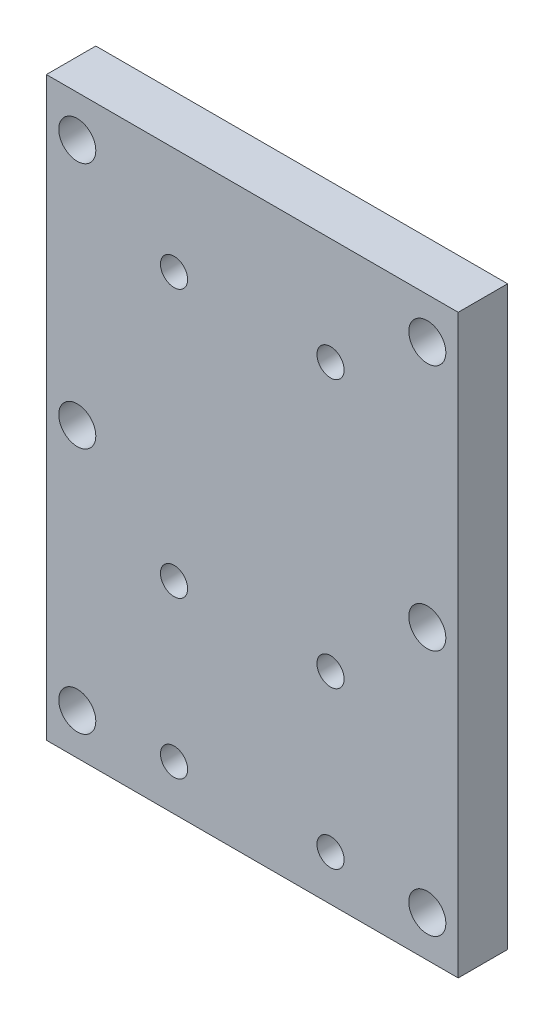
ISO-10303-21;
HEADER;
FILE_DESCRIPTION(('STEP AP214'),'2;1');
FILE_NAME('part.step','',(''),(''),'','','');
FILE_SCHEMA(('AUTOMOTIVE_DESIGN { 1 0 10303 214 1 1 1 1 }'));
ENDSEC;
DATA;
#1=APPLICATION_CONTEXT('core data for automotive mechanical design processes');
#2=APPLICATION_PROTOCOL_DEFINITION('international standard','automotive_design',2000,#1);
#3=PRODUCT_CONTEXT('',#1,'mechanical');
#4=PRODUCT('Part','Part','',(#3));
#5=PRODUCT_RELATED_PRODUCT_CATEGORY('part','',(#4));
#6=PRODUCT_DEFINITION_FORMATION('','',#4);
#7=PRODUCT_DEFINITION_CONTEXT('part definition',#1,'design');
#8=PRODUCT_DEFINITION('design','',#6,#7);
#9=PRODUCT_DEFINITION_SHAPE('','',#8);
#10=(LENGTH_UNIT() NAMED_UNIT(*) SI_UNIT(.MILLI.,.METRE.));
#11=(NAMED_UNIT(*) PLANE_ANGLE_UNIT() SI_UNIT($,.RADIAN.));
#12=(NAMED_UNIT(*) SI_UNIT($,.STERADIAN.) SOLID_ANGLE_UNIT());
#13=UNCERTAINTY_MEASURE_WITH_UNIT(LENGTH_MEASURE(1.E-05),#10,'distance_accuracy_value','');
#14=(GEOMETRIC_REPRESENTATION_CONTEXT(3) GLOBAL_UNCERTAINTY_ASSIGNED_CONTEXT((#13)) GLOBAL_UNIT_ASSIGNED_CONTEXT((#10,
#11,#12)) REPRESENTATION_CONTEXT('',''));
#15=CARTESIAN_POINT('',(0.,0.,0.));
#16=DIRECTION('',(0.,0.,1.));
#17=DIRECTION('',(1.,0.,0.));
#18=AXIS2_PLACEMENT_3D('',#15,#16,#17);
#19=CARTESIAN_POINT('',(-19.,-21.,0.));
#20=DIRECTION('',(0.,0.,-1.));
#21=DIRECTION('',(-1.,0.,0.));
#22=AXIS2_PLACEMENT_3D('',#19,#20,#21);
#23=CYLINDRICAL_SURFACE('',#22,5.5);
#24=CARTESIAN_POINT('',(-19.,-21.,6.8));
#25=DIRECTION('',(0.,0.,-1.));
#26=DIRECTION('',(-1.,0.,0.));
#27=AXIS2_PLACEMENT_3D('',#24,#25,#26);
#28=CIRCLE('',#27,5.5);
#29=CARTESIAN_POINT('',(-24.5,-21.,6.8));
#30=VERTEX_POINT('',#29);
#31=EDGE_CURVE('E12',#30,#30,#28,.T.);
#32=ORIENTED_EDGE('',*,*,#31,.F.);
#33=EDGE_LOOP('',(#32));
#34=FACE_BOUND('',#33,.T.);
#35=CARTESIAN_POINT('',(-19.,-21.,0.));
#36=DIRECTION('',(0.,0.,-1.));
#37=DIRECTION('',(-1.,0.,0.));
#38=AXIS2_PLACEMENT_3D('',#35,#36,#37);
#39=CIRCLE('',#38,5.5);
#40=CARTESIAN_POINT('',(-24.5,-21.,0.));
#41=VERTEX_POINT('',#40);
#42=EDGE_CURVE('E235',#41,#41,#39,.T.);
#43=ORIENTED_EDGE('',*,*,#42,.T.);
#44=EDGE_LOOP('',(#43));
#45=FACE_BOUND('',#44,.T.);
#46=ADVANCED_FACE('F126',(#34,#45),#23,.F.);
#47=CARTESIAN_POINT('',(-15.7,-21.,6.8));
#48=DIRECTION('',(0.,0.,1.));
#49=DIRECTION('',(1.,0.,0.));
#50=AXIS2_PLACEMENT_3D('',#47,#48,#49);
#51=PLANE('',#50);
#52=CARTESIAN_POINT('',(-19.,-21.,6.8));
#53=DIRECTION('',(0.,0.,-1.));
#54=DIRECTION('',(-1.,0.,0.));
#55=AXIS2_PLACEMENT_3D('',#52,#53,#54);
#56=CIRCLE('',#55,3.3);
#57=CARTESIAN_POINT('',(-22.3,-21.,6.8));
#58=VERTEX_POINT('',#57);
#59=EDGE_CURVE('E135',#58,#58,#56,.T.);
#60=ORIENTED_EDGE('',*,*,#59,.F.);
#61=EDGE_LOOP('',(#60));
#62=FACE_BOUND('',#61,.T.);
#63=ORIENTED_EDGE('',*,*,#31,.T.);
#64=EDGE_LOOP('',(#63));
#65=FACE_BOUND('',#64,.T.);
#66=ADVANCED_FACE('F248',(#62,#65),#51,.F.);
#67=CARTESIAN_POINT('',(-19.,-21.,0.));
#68=DIRECTION('',(0.,0.,-1.));
#69=DIRECTION('',(-1.,0.,0.));
#70=AXIS2_PLACEMENT_3D('',#67,#68,#69);
#71=CYLINDRICAL_SURFACE('',#70,3.3);
#72=CARTESIAN_POINT('',(-19.,-21.,12.));
#73=DIRECTION('',(0.,0.,-1.));
#74=DIRECTION('',(-1.,0.,0.));
#75=AXIS2_PLACEMENT_3D('',#72,#73,#74);
#76=CIRCLE('',#75,3.3);
#77=CARTESIAN_POINT('',(-22.3,-21.,12.));
#78=VERTEX_POINT('',#77);
#79=EDGE_CURVE('E238',#78,#78,#76,.T.);
#80=ORIENTED_EDGE('',*,*,#79,.F.);
#81=EDGE_LOOP('',(#80));
#82=FACE_BOUND('',#81,.T.);
#83=ORIENTED_EDGE('',*,*,#59,.T.);
#84=EDGE_LOOP('',(#83));
#85=FACE_BOUND('',#84,.T.);
#86=ADVANCED_FACE('F246',(#82,#85),#71,.F.);
#87=CARTESIAN_POINT('',(-19.,-59.,0.));
#88=DIRECTION('',(0.,0.,-1.));
#89=DIRECTION('',(-1.,0.,0.));
#90=AXIS2_PLACEMENT_3D('',#87,#88,#89);
#91=CYLINDRICAL_SURFACE('',#90,5.5);
#92=CARTESIAN_POINT('',(-19.,-59.,6.8));
#93=DIRECTION('',(0.,0.,-1.));
#94=DIRECTION('',(-1.,0.,0.));
#95=AXIS2_PLACEMENT_3D('',#92,#93,#94);
#96=CIRCLE('',#95,5.5);
#97=CARTESIAN_POINT('',(-24.5,-59.,6.8));
#98=VERTEX_POINT('',#97);
#99=EDGE_CURVE('E232',#98,#98,#96,.T.);
#100=ORIENTED_EDGE('',*,*,#99,.F.);
#101=EDGE_LOOP('',(#100));
#102=FACE_BOUND('',#101,.T.);
#103=CARTESIAN_POINT('',(-19.,-59.,0.));
#104=DIRECTION('',(0.,0.,-1.));
#105=DIRECTION('',(-1.,0.,0.));
#106=AXIS2_PLACEMENT_3D('',#103,#104,#105);
#107=CIRCLE('',#106,5.5);
#108=CARTESIAN_POINT('',(-24.5,-59.,0.));
#109=VERTEX_POINT('',#108);
#110=EDGE_CURVE('E220',#109,#109,#107,.T.);
#111=ORIENTED_EDGE('',*,*,#110,.T.);
#112=EDGE_LOOP('',(#111));
#113=FACE_BOUND('',#112,.T.);
#114=ADVANCED_FACE('F288',(#102,#113),#91,.F.);
#115=CARTESIAN_POINT('',(-15.7,-59.,6.8));
#116=DIRECTION('',(0.,0.,1.));
#117=DIRECTION('',(1.,0.,0.));
#118=AXIS2_PLACEMENT_3D('',#115,#116,#117);
#119=PLANE('',#118);
#120=CARTESIAN_POINT('',(-19.,-59.,6.8));
#121=DIRECTION('',(0.,0.,-1.));
#122=DIRECTION('',(-1.,0.,0.));
#123=AXIS2_PLACEMENT_3D('',#120,#121,#122);
#124=CIRCLE('',#123,3.3);
#125=CARTESIAN_POINT('',(-22.3,-59.,6.8));
#126=VERTEX_POINT('',#125);
#127=EDGE_CURVE('E228',#126,#126,#124,.T.);
#128=ORIENTED_EDGE('',*,*,#127,.F.);
#129=EDGE_LOOP('',(#128));
#130=FACE_BOUND('',#129,.T.);
#131=ORIENTED_EDGE('',*,*,#99,.T.);
#132=EDGE_LOOP('',(#131));
#133=FACE_BOUND('',#132,.T.);
#134=ADVANCED_FACE('F284',(#130,#133),#119,.F.);
#135=CARTESIAN_POINT('',(-19.,-59.,0.));
#136=DIRECTION('',(0.,0.,-1.));
#137=DIRECTION('',(-1.,0.,0.));
#138=AXIS2_PLACEMENT_3D('',#135,#136,#137);
#139=CYLINDRICAL_SURFACE('',#138,3.3);
#140=CARTESIAN_POINT('',(-19.,-59.,12.));
#141=DIRECTION('',(0.,0.,-1.));
#142=DIRECTION('',(-1.,0.,0.));
#143=AXIS2_PLACEMENT_3D('',#140,#141,#142);
#144=CIRCLE('',#143,3.3);
#145=CARTESIAN_POINT('',(-22.3,-59.,12.));
#146=VERTEX_POINT('',#145);
#147=EDGE_CURVE('E224',#146,#146,#144,.T.);
#148=ORIENTED_EDGE('',*,*,#147,.F.);
#149=EDGE_LOOP('',(#148));
#150=FACE_BOUND('',#149,.T.);
#151=ORIENTED_EDGE('',*,*,#127,.T.);
#152=EDGE_LOOP('',(#151));
#153=FACE_BOUND('',#152,.T.);
#154=ADVANCED_FACE('F267',(#150,#153),#139,.F.);
#155=CARTESIAN_POINT('',(0.,0.,12.));
#156=DIRECTION('',(0.,0.,1.));
#157=DIRECTION('',(1.,0.,0.));
#158=AXIS2_PLACEMENT_3D('',#155,#156,#157);
#159=PLANE('',#158);
#160=CARTESIAN_POINT('',(-19.,44.,12.));
#161=DIRECTION('',(0.,0.,-1.));
#162=DIRECTION('',(-1.,0.,0.));
#163=AXIS2_PLACEMENT_3D('',#160,#161,#162);
#164=CIRCLE('',#163,3.3);
#165=CARTESIAN_POINT('',(-22.3,44.,12.));
#166=VERTEX_POINT('',#165);
#167=EDGE_CURVE('E582',#166,#166,#164,.T.);
#168=ORIENTED_EDGE('',*,*,#167,.T.);
#169=EDGE_LOOP('',(#168));
#170=FACE_BOUND('',#169,.T.);
#171=CARTESIAN_POINT('',(19.,44.,12.));
#172=DIRECTION('',(0.,0.,-1.));
#173=DIRECTION('',(-1.,0.,0.));
#174=AXIS2_PLACEMENT_3D('',#171,#172,#173);
#175=CIRCLE('',#174,3.3);
#176=CARTESIAN_POINT('',(15.7,44.,12.));
#177=VERTEX_POINT('',#176);
#178=EDGE_CURVE('E606',#177,#177,#175,.T.);
#179=ORIENTED_EDGE('',*,*,#178,.T.);
#180=EDGE_LOOP('',(#179));
#181=FACE_BOUND('',#180,.T.);
#182=CARTESIAN_POINT('',(19.,-21.,12.));
#183=DIRECTION('',(0.,0.,-1.));
#184=DIRECTION('',(-1.,0.,0.));
#185=AXIS2_PLACEMENT_3D('',#182,#183,#184);
#186=CIRCLE('',#185,3.3);
#187=CARTESIAN_POINT('',(15.7,-21.,12.));
#188=VERTEX_POINT('',#187);
#189=EDGE_CURVE('E614',#188,#188,#186,.T.);
#190=ORIENTED_EDGE('',*,*,#189,.T.);
#191=EDGE_LOOP('',(#190));
#192=FACE_BOUND('',#191,.T.);
#193=CARTESIAN_POINT('',(-42.5000000000004,60.,12.));
#194=DIRECTION('',(0.,0.,1.));
#195=DIRECTION('',(1.,0.,0.));
#196=AXIS2_PLACEMENT_3D('',#193,#194,#195);
#197=CIRCLE('',#196,4.5);
#198=CARTESIAN_POINT('',(-38.0000000000004,60.,12.));
#199=VERTEX_POINT('',#198);
#200=EDGE_CURVE('E643',#199,#199,#197,.T.);
#201=ORIENTED_EDGE('',*,*,#200,.F.);
#202=EDGE_LOOP('',(#201));
#203=FACE_BOUND('',#202,.T.);
#204=CARTESIAN_POINT('',(-42.5000000000002,0.,12.));
#205=DIRECTION('',(0.,0.,1.));
#206=DIRECTION('',(1.,0.,0.));
#207=AXIS2_PLACEMENT_3D('',#204,#205,#206);
#208=CIRCLE('',#207,4.5);
#209=CARTESIAN_POINT('',(-38.0000000000002,0.,12.));
#210=VERTEX_POINT('',#209);
#211=EDGE_CURVE('E659',#210,#210,#208,.T.);
#212=ORIENTED_EDGE('',*,*,#211,.F.);
#213=EDGE_LOOP('',(#212));
#214=FACE_BOUND('',#213,.T.);
#215=CARTESIAN_POINT('',(42.5,-60.,12.));
#216=DIRECTION('',(0.,0.,1.));
#217=DIRECTION('',(1.,0.,0.));
#218=AXIS2_PLACEMENT_3D('',#215,#216,#217);
#219=CIRCLE('',#218,4.5);
#220=CARTESIAN_POINT('',(47.,-60.,12.));
#221=VERTEX_POINT('',#220);
#222=EDGE_CURVE('E675',#221,#221,#219,.T.);
#223=ORIENTED_EDGE('',*,*,#222,.F.);
#224=EDGE_LOOP('',(#223));
#225=FACE_BOUND('',#224,.T.);
#226=DIRECTION('',(1.,0.,0.));
#227=VECTOR('',#226,1.);
#228=CARTESIAN_POINT('',(-50.,-70.,12.));
#229=LINE('',#228,#227);
#230=CARTESIAN_POINT('',(-50.,-70.,12.));
#231=VERTEX_POINT('',#230);
#232=CARTESIAN_POINT('',(50.,-70.,12.));
#233=VERTEX_POINT('',#232);
#234=EDGE_CURVE('E178',#231,#233,#229,.T.);
#235=ORIENTED_EDGE('',*,*,#234,.T.);
#236=DIRECTION('',(0.,1.,0.));
#237=VECTOR('',#236,1.);
#238=CARTESIAN_POINT('',(50.,-70.,12.));
#239=LINE('',#238,#237);
#240=CARTESIAN_POINT('',(50.,70.,12.));
#241=VERTEX_POINT('',#240);
#242=EDGE_CURVE('E169',#233,#241,#239,.T.);
#243=ORIENTED_EDGE('',*,*,#242,.T.);
#244=DIRECTION('',(1.,0.,0.));
#245=VECTOR('',#244,1.);
#246=CARTESIAN_POINT('',(-50.,70.,12.));
#247=LINE('',#246,#245);
#248=CARTESIAN_POINT('',(-50.,70.,12.));
#249=VERTEX_POINT('',#248);
#250=EDGE_CURVE('E177',#249,#241,#247,.T.);
#251=ORIENTED_EDGE('',*,*,#250,.F.);
#252=DIRECTION('',(0.,1.,0.));
#253=VECTOR('',#252,1.);
#254=CARTESIAN_POINT('',(-50.,-70.,12.));
#255=LINE('',#254,#253);
#256=EDGE_CURVE('E193',#231,#249,#255,.T.);
#257=ORIENTED_EDGE('',*,*,#256,.F.);
#258=EDGE_LOOP('',(#235,#243,#251,#257));
#259=FACE_BOUND('',#258,.T.);
#260=CARTESIAN_POINT('',(42.4999999999998,0.,12.));
#261=DIRECTION('',(0.,0.,1.));
#262=DIRECTION('',(1.,0.,0.));
#263=AXIS2_PLACEMENT_3D('',#260,#261,#262);
#264=CIRCLE('',#263,4.5);
#265=CARTESIAN_POINT('',(46.9999999999998,0.,12.));
#266=VERTEX_POINT('',#265);
#267=EDGE_CURVE('E204',#266,#266,#264,.T.);
#268=ORIENTED_EDGE('',*,*,#267,.F.);
#269=EDGE_LOOP('',(#268));
#270=FACE_BOUND('',#269,.T.);
#271=CARTESIAN_POINT('',(42.4999999999996,60.,12.));
#272=DIRECTION('',(0.,0.,1.));
#273=DIRECTION('',(1.,0.,0.));
#274=AXIS2_PLACEMENT_3D('',#271,#272,#273);
#275=CIRCLE('',#274,4.5);
#276=CARTESIAN_POINT('',(46.9999999999996,60.,12.));
#277=VERTEX_POINT('',#276);
#278=EDGE_CURVE('E667',#277,#277,#275,.T.);
#279=ORIENTED_EDGE('',*,*,#278,.F.);
#280=EDGE_LOOP('',(#279));
#281=FACE_BOUND('',#280,.T.);
#282=CARTESIAN_POINT('',(-42.5,-60.,12.));
#283=DIRECTION('',(0.,0.,1.));
#284=DIRECTION('',(1.,0.,0.));
#285=AXIS2_PLACEMENT_3D('',#282,#283,#284);
#286=CIRCLE('',#285,4.5);
#287=CARTESIAN_POINT('',(-38.,-60.,12.));
#288=VERTEX_POINT('',#287);
#289=EDGE_CURVE('E651',#288,#288,#286,.T.);
#290=ORIENTED_EDGE('',*,*,#289,.F.);
#291=EDGE_LOOP('',(#290));
#292=FACE_BOUND('',#291,.T.);
#293=CARTESIAN_POINT('',(19.,-59.,12.));
#294=DIRECTION('',(0.,0.,-1.));
#295=DIRECTION('',(-1.,0.,0.));
#296=AXIS2_PLACEMENT_3D('',#293,#294,#295);
#297=CIRCLE('',#296,3.3);
#298=CARTESIAN_POINT('',(15.7,-59.,12.));
#299=VERTEX_POINT('',#298);
#300=EDGE_CURVE('E638',#299,#299,#297,.T.);
#301=ORIENTED_EDGE('',*,*,#300,.T.);
#302=EDGE_LOOP('',(#301));
#303=FACE_BOUND('',#302,.T.);
#304=ORIENTED_EDGE('',*,*,#147,.T.);
#305=EDGE_LOOP('',(#304));
#306=FACE_BOUND('',#305,.T.);
#307=ORIENTED_EDGE('',*,*,#79,.T.);
#308=EDGE_LOOP('',(#307));
#309=FACE_BOUND('',#308,.T.);
#310=ADVANCED_FACE('F173',(#170,#181,#192,#203,#214,#225,#259,#270,#281,#292,#303,#306,#309),
#159,.T.);
#311=CARTESIAN_POINT('',(0.,0.,0.));
#312=DIRECTION('',(0.,0.,1.));
#313=DIRECTION('',(1.,0.,0.));
#314=AXIS2_PLACEMENT_3D('',#311,#312,#313);
#315=PLANE('',#314);
#316=CARTESIAN_POINT('',(-19.,44.,0.));
#317=DIRECTION('',(0.,0.,-1.));
#318=DIRECTION('',(-1.,0.,0.));
#319=AXIS2_PLACEMENT_3D('',#316,#317,#318);
#320=CIRCLE('',#319,5.49999999999999);
#321=CARTESIAN_POINT('',(-24.5,44.,0.));
#322=VERTEX_POINT('',#321);
#323=EDGE_CURVE('E580',#322,#322,#320,.T.);
#324=ORIENTED_EDGE('',*,*,#323,.F.);
#325=EDGE_LOOP('',(#324));
#326=FACE_BOUND('',#325,.T.);
#327=CARTESIAN_POINT('',(19.,44.,0.));
#328=DIRECTION('',(0.,0.,-1.));
#329=DIRECTION('',(-1.,0.,0.));
#330=AXIS2_PLACEMENT_3D('',#327,#328,#329);
#331=CIRCLE('',#330,5.49999999999999);
#332=CARTESIAN_POINT('',(13.5,44.,0.));
#333=VERTEX_POINT('',#332);
#334=EDGE_CURVE('E594',#333,#333,#331,.T.);
#335=ORIENTED_EDGE('',*,*,#334,.F.);
#336=EDGE_LOOP('',(#335));
#337=FACE_BOUND('',#336,.T.);
#338=CARTESIAN_POINT('',(19.,-21.,0.));
#339=DIRECTION('',(0.,0.,-1.));
#340=DIRECTION('',(-1.,0.,0.));
#341=AXIS2_PLACEMENT_3D('',#338,#339,#340);
#342=CIRCLE('',#341,5.5);
#343=CARTESIAN_POINT('',(13.5,-21.,0.));
#344=VERTEX_POINT('',#343);
#345=EDGE_CURVE('E610',#344,#344,#342,.T.);
#346=ORIENTED_EDGE('',*,*,#345,.F.);
#347=EDGE_LOOP('',(#346));
#348=FACE_BOUND('',#347,.T.);
#349=DIRECTION('',(1.,0.,0.));
#350=VECTOR('',#349,1.);
#351=CARTESIAN_POINT('',(-50.,-70.,0.));
#352=LINE('',#351,#350);
#353=CARTESIAN_POINT('',(-50.,-70.,0.));
#354=VERTEX_POINT('',#353);
#355=CARTESIAN_POINT('',(50.,-70.,0.));
#356=VERTEX_POINT('',#355);
#357=EDGE_CURVE('E201',#354,#356,#352,.T.);
#358=ORIENTED_EDGE('',*,*,#357,.F.);
#359=DIRECTION('',(0.,1.,0.));
#360=VECTOR('',#359,1.);
#361=CARTESIAN_POINT('',(-50.,-70.,0.));
#362=LINE('',#361,#360);
#363=CARTESIAN_POINT('',(-50.,70.,0.));
#364=VERTEX_POINT('',#363);
#365=EDGE_CURVE('E210',#354,#364,#362,.T.);
#366=ORIENTED_EDGE('',*,*,#365,.T.);
#367=DIRECTION('',(1.,0.,0.));
#368=VECTOR('',#367,1.);
#369=CARTESIAN_POINT('',(-50.,70.,0.));
#370=LINE('',#369,#368);
#371=CARTESIAN_POINT('',(50.,70.,0.));
#372=VERTEX_POINT('',#371);
#373=EDGE_CURVE('E207',#364,#372,#370,.T.);
#374=ORIENTED_EDGE('',*,*,#373,.T.);
#375=DIRECTION('',(0.,1.,0.));
#376=VECTOR('',#375,1.);
#377=CARTESIAN_POINT('',(50.,-70.,0.));
#378=LINE('',#377,#376);
#379=EDGE_CURVE('E185',#356,#372,#378,.T.);
#380=ORIENTED_EDGE('',*,*,#379,.F.);
#381=EDGE_LOOP('',(#358,#366,#374,#380));
#382=FACE_BOUND('',#381,.T.);
#383=CARTESIAN_POINT('',(42.4999999999998,0.,0.));
#384=DIRECTION('',(0.,0.,1.));
#385=DIRECTION('',(1.,0.,0.));
#386=AXIS2_PLACEMENT_3D('',#383,#384,#385);
#387=CIRCLE('',#386,4.5);
#388=CARTESIAN_POINT('',(46.9999999999998,0.,0.));
#389=VERTEX_POINT('',#388);
#390=EDGE_CURVE('E678',#389,#389,#387,.T.);
#391=ORIENTED_EDGE('',*,*,#390,.T.);
#392=EDGE_LOOP('',(#391));
#393=FACE_BOUND('',#392,.T.);
#394=CARTESIAN_POINT('',(42.5,-60.,0.));
#395=DIRECTION('',(0.,0.,1.));
#396=DIRECTION('',(1.,0.,0.));
#397=AXIS2_PLACEMENT_3D('',#394,#395,#396);
#398=CIRCLE('',#397,4.5);
#399=CARTESIAN_POINT('',(47.,-60.,0.));
#400=VERTEX_POINT('',#399);
#401=EDGE_CURVE('E671',#400,#400,#398,.T.);
#402=ORIENTED_EDGE('',*,*,#401,.T.);
#403=EDGE_LOOP('',(#402));
#404=FACE_BOUND('',#403,.T.);
#405=CARTESIAN_POINT('',(42.4999999999996,60.,0.));
#406=DIRECTION('',(0.,0.,1.));
#407=DIRECTION('',(1.,0.,0.));
#408=AXIS2_PLACEMENT_3D('',#405,#406,#407);
#409=CIRCLE('',#408,4.5);
#410=CARTESIAN_POINT('',(46.9999999999996,60.,0.));
#411=VERTEX_POINT('',#410);
#412=EDGE_CURVE('E663',#411,#411,#409,.T.);
#413=ORIENTED_EDGE('',*,*,#412,.T.);
#414=EDGE_LOOP('',(#413));
#415=FACE_BOUND('',#414,.T.);
#416=CARTESIAN_POINT('',(-42.5000000000002,0.,0.));
#417=DIRECTION('',(0.,0.,1.));
#418=DIRECTION('',(1.,0.,0.));
#419=AXIS2_PLACEMENT_3D('',#416,#417,#418);
#420=CIRCLE('',#419,4.5);
#421=CARTESIAN_POINT('',(-38.0000000000002,0.,0.));
#422=VERTEX_POINT('',#421);
#423=EDGE_CURVE('E655',#422,#422,#420,.T.);
#424=ORIENTED_EDGE('',*,*,#423,.T.);
#425=EDGE_LOOP('',(#424));
#426=FACE_BOUND('',#425,.T.);
#427=CARTESIAN_POINT('',(-42.5,-60.,0.));
#428=DIRECTION('',(0.,0.,1.));
#429=DIRECTION('',(1.,0.,0.));
#430=AXIS2_PLACEMENT_3D('',#427,#428,#429);
#431=CIRCLE('',#430,4.5);
#432=CARTESIAN_POINT('',(-38.,-60.,0.));
#433=VERTEX_POINT('',#432);
#434=EDGE_CURVE('E647',#433,#433,#431,.T.);
#435=ORIENTED_EDGE('',*,*,#434,.T.);
#436=EDGE_LOOP('',(#435));
#437=FACE_BOUND('',#436,.T.);
#438=CARTESIAN_POINT('',(-42.5000000000004,60.,0.));
#439=DIRECTION('',(0.,0.,1.));
#440=DIRECTION('',(1.,0.,0.));
#441=AXIS2_PLACEMENT_3D('',#438,#439,#440);
#442=CIRCLE('',#441,4.5);
#443=CARTESIAN_POINT('',(-38.0000000000004,60.,0.));
#444=VERTEX_POINT('',#443);
#445=EDGE_CURVE('E642',#444,#444,#442,.T.);
#446=ORIENTED_EDGE('',*,*,#445,.T.);
#447=EDGE_LOOP('',(#446));
#448=FACE_BOUND('',#447,.T.);
#449=CARTESIAN_POINT('',(19.,-59.,0.));
#450=DIRECTION('',(0.,0.,-1.));
#451=DIRECTION('',(-1.,0.,0.));
#452=AXIS2_PLACEMENT_3D('',#449,#450,#451);
#453=CIRCLE('',#452,5.5);
#454=CARTESIAN_POINT('',(13.5,-59.,0.));
#455=VERTEX_POINT('',#454);
#456=EDGE_CURVE('E626',#455,#455,#453,.T.);
#457=ORIENTED_EDGE('',*,*,#456,.F.);
#458=EDGE_LOOP('',(#457));
#459=FACE_BOUND('',#458,.T.);
#460=ORIENTED_EDGE('',*,*,#110,.F.);
#461=EDGE_LOOP('',(#460));
#462=FACE_BOUND('',#461,.T.);
#463=ORIENTED_EDGE('',*,*,#42,.F.);
#464=EDGE_LOOP('',(#463));
#465=FACE_BOUND('',#464,.T.);
#466=ADVANCED_FACE('F257',(#326,#337,#348,#382,#393,#404,#415,#426,#437,#448,#459,#462,#465),
#315,.F.);
#467=CARTESIAN_POINT('',(-50.,-70.,12.));
#468=DIRECTION('',(0.,1.,0.));
#469=DIRECTION('',(0.,0.,1.));
#470=AXIS2_PLACEMENT_3D('',#467,#468,#469);
#471=PLANE('',#470);
#472=ORIENTED_EDGE('',*,*,#357,.T.);
#473=DIRECTION('',(0.,0.,-1.));
#474=VECTOR('',#473,1.);
#475=CARTESIAN_POINT('',(50.,-70.,12.));
#476=LINE('',#475,#474);
#477=EDGE_CURVE('E189',#233,#356,#476,.T.);
#478=ORIENTED_EDGE('',*,*,#477,.F.);
#479=ORIENTED_EDGE('',*,*,#234,.F.);
#480=DIRECTION('',(0.,0.,-1.));
#481=VECTOR('',#480,1.);
#482=CARTESIAN_POINT('',(-50.,-70.,12.));
#483=LINE('',#482,#481);
#484=EDGE_CURVE('E143',#231,#354,#483,.T.);
#485=ORIENTED_EDGE('',*,*,#484,.T.);
#486=EDGE_LOOP('',(#472,#478,#479,#485));
#487=FACE_BOUND('',#486,.T.);
#488=ADVANCED_FACE('F259',(#487),#471,.F.);
#489=CARTESIAN_POINT('',(50.,-70.,12.));
#490=DIRECTION('',(-1.,0.,0.));
#491=DIRECTION('',(0.,0.,1.));
#492=AXIS2_PLACEMENT_3D('',#489,#490,#491);
#493=PLANE('',#492);
#494=ORIENTED_EDGE('',*,*,#379,.T.);
#495=DIRECTION('',(0.,0.,-1.));
#496=VECTOR('',#495,1.);
#497=CARTESIAN_POINT('',(50.,70.,12.));
#498=LINE('',#497,#496);
#499=EDGE_CURVE('E183',#241,#372,#498,.T.);
#500=ORIENTED_EDGE('',*,*,#499,.F.);
#501=ORIENTED_EDGE('',*,*,#242,.F.);
#502=ORIENTED_EDGE('',*,*,#477,.T.);
#503=EDGE_LOOP('',(#494,#500,#501,#502));
#504=FACE_BOUND('',#503,.T.);
#505=ADVANCED_FACE('F184',(#504),#493,.F.);
#506=CARTESIAN_POINT('',(-50.,70.,12.));
#507=DIRECTION('',(0.,1.,0.));
#508=DIRECTION('',(0.,0.,1.));
#509=AXIS2_PLACEMENT_3D('',#506,#507,#508);
#510=PLANE('',#509);
#511=ORIENTED_EDGE('',*,*,#373,.F.);
#512=DIRECTION('',(0.,0.,-1.));
#513=VECTOR('',#512,1.);
#514=CARTESIAN_POINT('',(-50.,70.,12.));
#515=LINE('',#514,#513);
#516=EDGE_CURVE('E157',#249,#364,#515,.T.);
#517=ORIENTED_EDGE('',*,*,#516,.F.);
#518=ORIENTED_EDGE('',*,*,#250,.T.);
#519=ORIENTED_EDGE('',*,*,#499,.T.);
#520=EDGE_LOOP('',(#511,#517,#518,#519));
#521=FACE_BOUND('',#520,.T.);
#522=ADVANCED_FACE('F191',(#521),#510,.T.);
#523=CARTESIAN_POINT('',(-50.,-70.,12.));
#524=DIRECTION('',(-1.,0.,0.));
#525=DIRECTION('',(0.,0.,1.));
#526=AXIS2_PLACEMENT_3D('',#523,#524,#525);
#527=PLANE('',#526);
#528=ORIENTED_EDGE('',*,*,#365,.F.);
#529=ORIENTED_EDGE('',*,*,#484,.F.);
#530=ORIENTED_EDGE('',*,*,#256,.T.);
#531=ORIENTED_EDGE('',*,*,#516,.T.);
#532=EDGE_LOOP('',(#528,#529,#530,#531));
#533=FACE_BOUND('',#532,.T.);
#534=ADVANCED_FACE('F274',(#533),#527,.T.);
#535=CARTESIAN_POINT('',(42.4999999999998,0.,12.));
#536=DIRECTION('',(0.,0.,-1.));
#537=DIRECTION('',(-1.,0.,0.));
#538=AXIS2_PLACEMENT_3D('',#535,#536,#537);
#539=CYLINDRICAL_SURFACE('',#538,4.5);
#540=ORIENTED_EDGE('',*,*,#267,.T.);
#541=EDGE_LOOP('',(#540));
#542=FACE_BOUND('',#541,.T.);
#543=ORIENTED_EDGE('',*,*,#390,.F.);
#544=EDGE_LOOP('',(#543));
#545=FACE_BOUND('',#544,.T.);
#546=ADVANCED_FACE('F277',(#542,#545),#539,.F.);
#547=CARTESIAN_POINT('',(42.5,-60.,12.));
#548=DIRECTION('',(0.,0.,-1.));
#549=DIRECTION('',(-1.,0.,0.));
#550=AXIS2_PLACEMENT_3D('',#547,#548,#549);
#551=CYLINDRICAL_SURFACE('',#550,4.5);
#552=ORIENTED_EDGE('',*,*,#222,.T.);
#553=EDGE_LOOP('',(#552));
#554=FACE_BOUND('',#553,.T.);
#555=ORIENTED_EDGE('',*,*,#401,.F.);
#556=EDGE_LOOP('',(#555));
#557=FACE_BOUND('',#556,.T.);
#558=ADVANCED_FACE('F345',(#554,#557),#551,.F.);
#559=CARTESIAN_POINT('',(42.4999999999996,60.,12.));
#560=DIRECTION('',(0.,0.,-1.));
#561=DIRECTION('',(-1.,0.,0.));
#562=AXIS2_PLACEMENT_3D('',#559,#560,#561);
#563=CYLINDRICAL_SURFACE('',#562,4.5);
#564=ORIENTED_EDGE('',*,*,#278,.T.);
#565=EDGE_LOOP('',(#564));
#566=FACE_BOUND('',#565,.T.);
#567=ORIENTED_EDGE('',*,*,#412,.F.);
#568=EDGE_LOOP('',(#567));
#569=FACE_BOUND('',#568,.T.);
#570=ADVANCED_FACE('F353',(#566,#569),#563,.F.);
#571=CARTESIAN_POINT('',(-42.5000000000002,0.,12.));
#572=DIRECTION('',(0.,0.,-1.));
#573=DIRECTION('',(-1.,0.,0.));
#574=AXIS2_PLACEMENT_3D('',#571,#572,#573);
#575=CYLINDRICAL_SURFACE('',#574,4.5);
#576=ORIENTED_EDGE('',*,*,#211,.T.);
#577=EDGE_LOOP('',(#576));
#578=FACE_BOUND('',#577,.T.);
#579=ORIENTED_EDGE('',*,*,#423,.F.);
#580=EDGE_LOOP('',(#579));
#581=FACE_BOUND('',#580,.T.);
#582=ADVANCED_FACE('F362',(#578,#581),#575,.F.);
#583=CARTESIAN_POINT('',(-42.5,-60.,12.));
#584=DIRECTION('',(0.,0.,-1.));
#585=DIRECTION('',(-1.,0.,0.));
#586=AXIS2_PLACEMENT_3D('',#583,#584,#585);
#587=CYLINDRICAL_SURFACE('',#586,4.5);
#588=ORIENTED_EDGE('',*,*,#289,.T.);
#589=EDGE_LOOP('',(#588));
#590=FACE_BOUND('',#589,.T.);
#591=ORIENTED_EDGE('',*,*,#434,.F.);
#592=EDGE_LOOP('',(#591));
#593=FACE_BOUND('',#592,.T.);
#594=ADVANCED_FACE('F371',(#590,#593),#587,.F.);
#595=CARTESIAN_POINT('',(-42.5000000000004,60.,12.));
#596=DIRECTION('',(0.,0.,-1.));
#597=DIRECTION('',(-1.,0.,0.));
#598=AXIS2_PLACEMENT_3D('',#595,#596,#597);
#599=CYLINDRICAL_SURFACE('',#598,4.5);
#600=ORIENTED_EDGE('',*,*,#200,.T.);
#601=EDGE_LOOP('',(#600));
#602=FACE_BOUND('',#601,.T.);
#603=ORIENTED_EDGE('',*,*,#445,.F.);
#604=EDGE_LOOP('',(#603));
#605=FACE_BOUND('',#604,.T.);
#606=ADVANCED_FACE('F380',(#602,#605),#599,.F.);
#607=CARTESIAN_POINT('',(19.,-59.,0.));
#608=DIRECTION('',(0.,0.,-1.));
#609=DIRECTION('',(-1.,0.,0.));
#610=AXIS2_PLACEMENT_3D('',#607,#608,#609);
#611=CYLINDRICAL_SURFACE('',#610,3.3);
#612=ORIENTED_EDGE('',*,*,#300,.F.);
#613=EDGE_LOOP('',(#612));
#614=FACE_BOUND('',#613,.T.);
#615=CARTESIAN_POINT('',(19.,-59.,6.8));
#616=DIRECTION('',(0.,0.,-1.));
#617=DIRECTION('',(-1.,0.,0.));
#618=AXIS2_PLACEMENT_3D('',#615,#616,#617);
#619=CIRCLE('',#618,3.3);
#620=CARTESIAN_POINT('',(15.7,-59.,6.8));
#621=VERTEX_POINT('',#620);
#622=EDGE_CURVE('E634',#621,#621,#619,.T.);
#623=ORIENTED_EDGE('',*,*,#622,.T.);
#624=EDGE_LOOP('',(#623));
#625=FACE_BOUND('',#624,.T.);
#626=ADVANCED_FACE('F389',(#614,#625),#611,.F.);
#627=CARTESIAN_POINT('',(22.3,-59.,6.8));
#628=DIRECTION('',(0.,0.,1.));
#629=DIRECTION('',(1.,0.,0.));
#630=AXIS2_PLACEMENT_3D('',#627,#628,#629);
#631=PLANE('',#630);
#632=ORIENTED_EDGE('',*,*,#622,.F.);
#633=EDGE_LOOP('',(#632));
#634=FACE_BOUND('',#633,.T.);
#635=CARTESIAN_POINT('',(19.,-59.,6.8));
#636=DIRECTION('',(0.,0.,-1.));
#637=DIRECTION('',(-1.,0.,0.));
#638=AXIS2_PLACEMENT_3D('',#635,#636,#637);
#639=CIRCLE('',#638,5.5);
#640=CARTESIAN_POINT('',(13.5,-59.,6.8));
#641=VERTEX_POINT('',#640);
#642=EDGE_CURVE('E630',#641,#641,#639,.T.);
#643=ORIENTED_EDGE('',*,*,#642,.T.);
#644=EDGE_LOOP('',(#643));
#645=FACE_BOUND('',#644,.T.);
#646=ADVANCED_FACE('F398',(#634,#645),#631,.F.);
#647=CARTESIAN_POINT('',(19.,-59.,0.));
#648=DIRECTION('',(0.,0.,-1.));
#649=DIRECTION('',(-1.,0.,0.));
#650=AXIS2_PLACEMENT_3D('',#647,#648,#649);
#651=CYLINDRICAL_SURFACE('',#650,5.5);
#652=ORIENTED_EDGE('',*,*,#642,.F.);
#653=EDGE_LOOP('',(#652));
#654=FACE_BOUND('',#653,.T.);
#655=ORIENTED_EDGE('',*,*,#456,.T.);
#656=EDGE_LOOP('',(#655));
#657=FACE_BOUND('',#656,.T.);
#658=ADVANCED_FACE('F407',(#654,#657),#651,.F.);
#659=CARTESIAN_POINT('',(19.,-21.,0.));
#660=DIRECTION('',(0.,0.,-1.));
#661=DIRECTION('',(-1.,0.,0.));
#662=AXIS2_PLACEMENT_3D('',#659,#660,#661);
#663=CYLINDRICAL_SURFACE('',#662,3.3);
#664=ORIENTED_EDGE('',*,*,#189,.F.);
#665=EDGE_LOOP('',(#664));
#666=FACE_BOUND('',#665,.T.);
#667=CARTESIAN_POINT('',(19.,-21.,6.8));
#668=DIRECTION('',(0.,0.,-1.));
#669=DIRECTION('',(-1.,0.,0.));
#670=AXIS2_PLACEMENT_3D('',#667,#668,#669);
#671=CIRCLE('',#670,3.3);
#672=CARTESIAN_POINT('',(15.7,-21.,6.8));
#673=VERTEX_POINT('',#672);
#674=EDGE_CURVE('E622',#673,#673,#671,.T.);
#675=ORIENTED_EDGE('',*,*,#674,.T.);
#676=EDGE_LOOP('',(#675));
#677=FACE_BOUND('',#676,.T.);
#678=ADVANCED_FACE('F416',(#666,#677),#663,.F.);
#679=CARTESIAN_POINT('',(22.3,-21.,6.8));
#680=DIRECTION('',(0.,0.,1.));
#681=DIRECTION('',(1.,0.,0.));
#682=AXIS2_PLACEMENT_3D('',#679,#680,#681);
#683=PLANE('',#682);
#684=ORIENTED_EDGE('',*,*,#674,.F.);
#685=EDGE_LOOP('',(#684));
#686=FACE_BOUND('',#685,.T.);
#687=CARTESIAN_POINT('',(19.,-21.,6.8));
#688=DIRECTION('',(0.,0.,-1.));
#689=DIRECTION('',(-1.,0.,0.));
#690=AXIS2_PLACEMENT_3D('',#687,#688,#689);
#691=CIRCLE('',#690,5.5);
#692=CARTESIAN_POINT('',(13.5,-21.,6.8));
#693=VERTEX_POINT('',#692);
#694=EDGE_CURVE('E618',#693,#693,#691,.T.);
#695=ORIENTED_EDGE('',*,*,#694,.T.);
#696=EDGE_LOOP('',(#695));
#697=FACE_BOUND('',#696,.T.);
#698=ADVANCED_FACE('F426',(#686,#697),#683,.F.);
#699=CARTESIAN_POINT('',(19.,-21.,0.));
#700=DIRECTION('',(0.,0.,-1.));
#701=DIRECTION('',(-1.,0.,0.));
#702=AXIS2_PLACEMENT_3D('',#699,#700,#701);
#703=CYLINDRICAL_SURFACE('',#702,5.5);
#704=ORIENTED_EDGE('',*,*,#694,.F.);
#705=EDGE_LOOP('',(#704));
#706=FACE_BOUND('',#705,.T.);
#707=ORIENTED_EDGE('',*,*,#345,.T.);
#708=EDGE_LOOP('',(#707));
#709=FACE_BOUND('',#708,.T.);
#710=ADVANCED_FACE('F435',(#706,#709),#703,.F.);
#711=CARTESIAN_POINT('',(19.,44.,0.));
#712=DIRECTION('',(0.,0.,-1.));
#713=DIRECTION('',(-1.,0.,0.));
#714=AXIS2_PLACEMENT_3D('',#711,#712,#713);
#715=CYLINDRICAL_SURFACE('',#714,3.3);
#716=ORIENTED_EDGE('',*,*,#178,.F.);
#717=EDGE_LOOP('',(#716));
#718=FACE_BOUND('',#717,.T.);
#719=CARTESIAN_POINT('',(19.,44.,6.8));
#720=DIRECTION('',(0.,0.,-1.));
#721=DIRECTION('',(-1.,0.,0.));
#722=AXIS2_PLACEMENT_3D('',#719,#720,#721);
#723=CIRCLE('',#722,3.30000000000001);
#724=CARTESIAN_POINT('',(15.7,44.,6.8));
#725=VERTEX_POINT('',#724);
#726=EDGE_CURVE('E602',#725,#725,#723,.T.);
#727=ORIENTED_EDGE('',*,*,#726,.T.);
#728=EDGE_LOOP('',(#727));
#729=FACE_BOUND('',#728,.T.);
#730=ADVANCED_FACE('F444',(#718,#729),#715,.F.);
#731=CARTESIAN_POINT('',(22.3,44.,6.8));
#732=DIRECTION('',(0.,0.,1.));
#733=DIRECTION('',(1.,0.,0.));
#734=AXIS2_PLACEMENT_3D('',#731,#732,#733);
#735=PLANE('',#734);
#736=ORIENTED_EDGE('',*,*,#726,.F.);
#737=EDGE_LOOP('',(#736));
#738=FACE_BOUND('',#737,.T.);
#739=CARTESIAN_POINT('',(19.,44.,6.8));
#740=DIRECTION('',(0.,0.,-1.));
#741=DIRECTION('',(-1.,0.,0.));
#742=AXIS2_PLACEMENT_3D('',#739,#740,#741);
#743=CIRCLE('',#742,5.49999999999999);
#744=CARTESIAN_POINT('',(13.5,44.,6.8));
#745=VERTEX_POINT('',#744);
#746=EDGE_CURVE('E598',#745,#745,#743,.T.);
#747=ORIENTED_EDGE('',*,*,#746,.T.);
#748=EDGE_LOOP('',(#747));
#749=FACE_BOUND('',#748,.T.);
#750=ADVANCED_FACE('F453',(#738,#749),#735,.F.);
#751=CARTESIAN_POINT('',(19.,44.,0.));
#752=DIRECTION('',(0.,0.,-1.));
#753=DIRECTION('',(-1.,0.,0.));
#754=AXIS2_PLACEMENT_3D('',#751,#752,#753);
#755=CYLINDRICAL_SURFACE('',#754,5.49999999999999);
#756=ORIENTED_EDGE('',*,*,#746,.F.);
#757=EDGE_LOOP('',(#756));
#758=FACE_BOUND('',#757,.T.);
#759=ORIENTED_EDGE('',*,*,#334,.T.);
#760=EDGE_LOOP('',(#759));
#761=FACE_BOUND('',#760,.T.);
#762=ADVANCED_FACE('F462',(#758,#761),#755,.F.);
#763=CARTESIAN_POINT('',(-19.,44.,0.));
#764=DIRECTION('',(0.,0.,-1.));
#765=DIRECTION('',(-1.,0.,0.));
#766=AXIS2_PLACEMENT_3D('',#763,#764,#765);
#767=CYLINDRICAL_SURFACE('',#766,3.3);
#768=ORIENTED_EDGE('',*,*,#167,.F.);
#769=EDGE_LOOP('',(#768));
#770=FACE_BOUND('',#769,.T.);
#771=CARTESIAN_POINT('',(-19.,44.,6.8));
#772=DIRECTION('',(0.,0.,-1.));
#773=DIRECTION('',(-1.,0.,0.));
#774=AXIS2_PLACEMENT_3D('',#771,#772,#773);
#775=CIRCLE('',#774,3.30000000000001);
#776=CARTESIAN_POINT('',(-22.3,44.,6.8));
#777=VERTEX_POINT('',#776);
#778=EDGE_CURVE('E590',#777,#777,#775,.T.);
#779=ORIENTED_EDGE('',*,*,#778,.T.);
#780=EDGE_LOOP('',(#779));
#781=FACE_BOUND('',#780,.T.);
#782=ADVANCED_FACE('F470',(#770,#781),#767,.F.);
#783=CARTESIAN_POINT('',(-15.7,44.,6.8));
#784=DIRECTION('',(0.,0.,1.));
#785=DIRECTION('',(1.,0.,0.));
#786=AXIS2_PLACEMENT_3D('',#783,#784,#785);
#787=PLANE('',#786);
#788=ORIENTED_EDGE('',*,*,#778,.F.);
#789=EDGE_LOOP('',(#788));
#790=FACE_BOUND('',#789,.T.);
#791=CARTESIAN_POINT('',(-19.,44.,6.8));
#792=DIRECTION('',(0.,0.,-1.));
#793=DIRECTION('',(-1.,0.,0.));
#794=AXIS2_PLACEMENT_3D('',#791,#792,#793);
#795=CIRCLE('',#794,5.49999999999999);
#796=CARTESIAN_POINT('',(-24.5,44.,6.8));
#797=VERTEX_POINT('',#796);
#798=EDGE_CURVE('E578',#797,#797,#795,.T.);
#799=ORIENTED_EDGE('',*,*,#798,.T.);
#800=EDGE_LOOP('',(#799));
#801=FACE_BOUND('',#800,.T.);
#802=ADVANCED_FACE('F478',(#790,#801),#787,.F.);
#803=CARTESIAN_POINT('',(-19.,44.,0.));
#804=DIRECTION('',(0.,0.,-1.));
#805=DIRECTION('',(-1.,0.,0.));
#806=AXIS2_PLACEMENT_3D('',#803,#804,#805);
#807=CYLINDRICAL_SURFACE('',#806,5.49999999999999);
#808=ORIENTED_EDGE('',*,*,#798,.F.);
#809=EDGE_LOOP('',(#808));
#810=FACE_BOUND('',#809,.T.);
#811=ORIENTED_EDGE('',*,*,#323,.T.);
#812=EDGE_LOOP('',(#811));
#813=FACE_BOUND('',#812,.T.);
#814=ADVANCED_FACE('F487',(#810,#813),#807,.F.);
#815=CLOSED_SHELL('',(#46,#66,#86,#114,#134,#154,#310,#466,#488,#505,#522,#534,#546,#558,#570,
#582,#594,#606,#626,#646,#658,#678,#698,#710,#730,#750,#762,#782,#802,#814));
#816=MANIFOLD_SOLID_BREP('B2',#815);
#817=ADVANCED_BREP_SHAPE_REPRESENTATION('',(#18,#816),#14);
#818=SHAPE_DEFINITION_REPRESENTATION(#9,#817);
ENDSEC;
END-ISO-10303-21;
